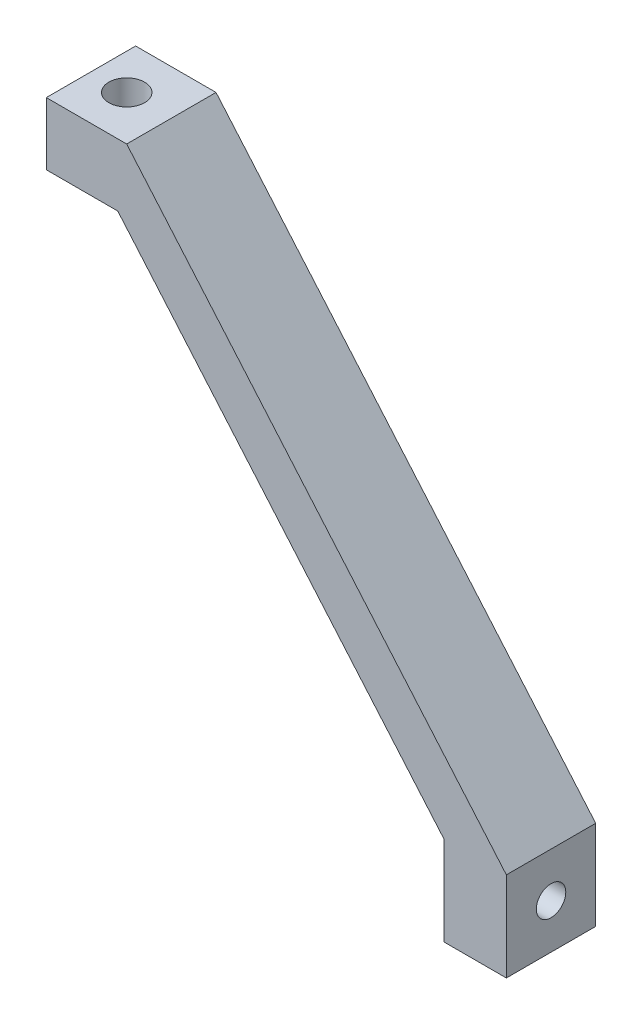
ISO-10303-21;
HEADER;
FILE_DESCRIPTION(('STEP AP214'),'2;1');
FILE_NAME('part.step','',(''),(''),'','','');
FILE_SCHEMA(('AUTOMOTIVE_DESIGN { 1 0 10303 214 1 1 1 1 }'));
ENDSEC;
DATA;
#1=APPLICATION_CONTEXT('core data for automotive mechanical design processes');
#2=APPLICATION_PROTOCOL_DEFINITION('international standard','automotive_design',2000,#1);
#3=PRODUCT_CONTEXT('',#1,'mechanical');
#4=PRODUCT('Part','Part','',(#3));
#5=PRODUCT_RELATED_PRODUCT_CATEGORY('part','',(#4));
#6=PRODUCT_DEFINITION_FORMATION('','',#4);
#7=PRODUCT_DEFINITION_CONTEXT('part definition',#1,'design');
#8=PRODUCT_DEFINITION('design','',#6,#7);
#9=PRODUCT_DEFINITION_SHAPE('','',#8);
#10=(LENGTH_UNIT() NAMED_UNIT(*) SI_UNIT(.MILLI.,.METRE.));
#11=(NAMED_UNIT(*) PLANE_ANGLE_UNIT() SI_UNIT($,.RADIAN.));
#12=(NAMED_UNIT(*) SI_UNIT($,.STERADIAN.) SOLID_ANGLE_UNIT());
#13=UNCERTAINTY_MEASURE_WITH_UNIT(LENGTH_MEASURE(1.E-05),#10,'distance_accuracy_value','');
#14=(GEOMETRIC_REPRESENTATION_CONTEXT(3) GLOBAL_UNCERTAINTY_ASSIGNED_CONTEXT((#13)) GLOBAL_UNIT_ASSIGNED_CONTEXT((#10,
#11,#12)) REPRESENTATION_CONTEXT('',''));
#15=CARTESIAN_POINT('',(0.,0.,0.));
#16=DIRECTION('',(0.,0.,1.));
#17=DIRECTION('',(1.,0.,0.));
#18=AXIS2_PLACEMENT_3D('',#15,#16,#17);
#19=CARTESIAN_POINT('',(0.,0.,10.));
#20=DIRECTION('',(-0.759384877297726,-0.650641689512375,0.));
#21=DIRECTION('',(0.650641689512375,-0.759384877297726,0.));
#22=AXIS2_PLACEMENT_3D('',#19,#20,#21);
#23=PLANE('',#22);
#24=DIRECTION('',(-0.650641689512375,0.759384877297726,0.));
#25=VECTOR('',#24,1.);
#26=CARTESIAN_POINT('',(0.,0.,0.));
#27=LINE('',#26,#25);
#28=CARTESIAN_POINT('',(0.,0.,0.));
#29=VERTEX_POINT('',#28);
#30=CARTESIAN_POINT('',(-36.4997207632834,42.6,0.));
#31=VERTEX_POINT('',#30);
#32=EDGE_CURVE('E141',#29,#31,#27,.T.);
#33=ORIENTED_EDGE('',*,*,#32,.F.);
#34=DIRECTION('',(0.,0.,-1.));
#35=VECTOR('',#34,1.);
#36=CARTESIAN_POINT('',(0.,0.,10.));
#37=LINE('',#36,#35);
#38=CARTESIAN_POINT('',(0.,0.,10.));
#39=VERTEX_POINT('',#38);
#40=EDGE_CURVE('E11',#39,#29,#37,.T.);
#41=ORIENTED_EDGE('',*,*,#40,.F.);
#42=DIRECTION('',(-0.650641689512375,0.759384877297726,0.));
#43=VECTOR('',#42,1.);
#44=CARTESIAN_POINT('',(0.,0.,10.));
#45=LINE('',#44,#43);
#46=CARTESIAN_POINT('',(-36.4997207632834,42.6,10.));
#47=VERTEX_POINT('',#46);
#48=EDGE_CURVE('E167',#39,#47,#45,.T.);
#49=ORIENTED_EDGE('',*,*,#48,.T.);
#50=DIRECTION('',(0.,0.,-1.));
#51=VECTOR('',#50,1.);
#52=CARTESIAN_POINT('',(-36.4997207632834,42.6,10.));
#53=LINE('',#52,#51);
#54=EDGE_CURVE('E58',#47,#31,#53,.T.);
#55=ORIENTED_EDGE('',*,*,#54,.T.);
#56=EDGE_LOOP('',(#33,#41,#49,#55));
#57=FACE_BOUND('',#56,.T.);
#58=ADVANCED_FACE('F40',(#57),#23,.T.);
#59=CARTESIAN_POINT('',(0.,0.,10.));
#60=DIRECTION('',(1.,0.,0.));
#61=DIRECTION('',(0.,0.,-1.));
#62=AXIS2_PLACEMENT_3D('',#59,#60,#61);
#63=PLANE('',#62);
#64=CARTESIAN_POINT('',(0.,-5.,5.));
#65=DIRECTION('',(1.,0.,0.));
#66=DIRECTION('',(0.,0.,-1.));
#67=AXIS2_PLACEMENT_3D('',#64,#65,#66);
#68=CIRCLE('',#67,1.65);
#69=CARTESIAN_POINT('',(0.,-5.,3.35));
#70=VERTEX_POINT('',#69);
#71=EDGE_CURVE('E214',#70,#70,#68,.T.);
#72=ORIENTED_EDGE('',*,*,#71,.T.);
#73=EDGE_LOOP('',(#72));
#74=FACE_BOUND('',#73,.T.);
#75=DIRECTION('',(0.,-1.,0.));
#76=VECTOR('',#75,1.);
#77=CARTESIAN_POINT('',(0.,0.,0.));
#78=LINE('',#77,#76);
#79=CARTESIAN_POINT('',(0.,-10.,0.));
#80=VERTEX_POINT('',#79);
#81=EDGE_CURVE('E144',#29,#80,#78,.T.);
#82=ORIENTED_EDGE('',*,*,#81,.T.);
#83=DIRECTION('',(0.,0.,-1.));
#84=VECTOR('',#83,1.);
#85=CARTESIAN_POINT('',(0.,-10.,10.));
#86=LINE('',#85,#84);
#87=CARTESIAN_POINT('',(0.,-10.,10.));
#88=VERTEX_POINT('',#87);
#89=EDGE_CURVE('E50',#88,#80,#86,.T.);
#90=ORIENTED_EDGE('',*,*,#89,.F.);
#91=DIRECTION('',(0.,-1.,0.));
#92=VECTOR('',#91,1.);
#93=CARTESIAN_POINT('',(0.,0.,10.));
#94=LINE('',#93,#92);
#95=EDGE_CURVE('E203',#39,#88,#94,.T.);
#96=ORIENTED_EDGE('',*,*,#95,.F.);
#97=ORIENTED_EDGE('',*,*,#40,.T.);
#98=EDGE_LOOP('',(#82,#90,#96,#97));
#99=FACE_BOUND('',#98,.T.);
#100=ADVANCED_FACE('F235',(#74,#99),#63,.F.);
#101=CARTESIAN_POINT('',(0.,-10.,10.));
#102=DIRECTION('',(0.,1.,0.));
#103=DIRECTION('',(0.,0.,1.));
#104=AXIS2_PLACEMENT_3D('',#101,#102,#103);
#105=PLANE('',#104);
#106=DIRECTION('',(1.,0.,0.));
#107=VECTOR('',#106,1.);
#108=CARTESIAN_POINT('',(0.,-10.,0.));
#109=LINE('',#108,#107);
#110=CARTESIAN_POINT('',(7.,-10.,0.));
#111=VERTEX_POINT('',#110);
#112=EDGE_CURVE('E147',#80,#111,#109,.T.);
#113=ORIENTED_EDGE('',*,*,#112,.T.);
#114=DIRECTION('',(0.,0.,-1.));
#115=VECTOR('',#114,1.);
#116=CARTESIAN_POINT('',(7.,-10.,10.));
#117=LINE('',#116,#115);
#118=CARTESIAN_POINT('',(7.,-10.,10.));
#119=VERTEX_POINT('',#118);
#120=EDGE_CURVE('E177',#119,#111,#117,.T.);
#121=ORIENTED_EDGE('',*,*,#120,.F.);
#122=DIRECTION('',(1.,0.,0.));
#123=VECTOR('',#122,1.);
#124=CARTESIAN_POINT('',(0.,-10.,10.));
#125=LINE('',#124,#123);
#126=EDGE_CURVE('E188',#88,#119,#125,.T.);
#127=ORIENTED_EDGE('',*,*,#126,.F.);
#128=ORIENTED_EDGE('',*,*,#89,.T.);
#129=EDGE_LOOP('',(#113,#121,#127,#128));
#130=FACE_BOUND('',#129,.T.);
#131=ADVANCED_FACE('F186',(#130),#105,.F.);
#132=CARTESIAN_POINT('',(7.,0.,10.));
#133=DIRECTION('',(1.,0.,0.));
#134=DIRECTION('',(0.,0.,-1.));
#135=AXIS2_PLACEMENT_3D('',#132,#133,#134);
#136=PLANE('',#135);
#137=CARTESIAN_POINT('',(7.,-5.,5.));
#138=DIRECTION('',(1.,0.,0.));
#139=DIRECTION('',(0.,0.,-1.));
#140=AXIS2_PLACEMENT_3D('',#137,#138,#139);
#141=CIRCLE('',#140,1.65);
#142=CARTESIAN_POINT('',(7.,-5.,3.35));
#143=VERTEX_POINT('',#142);
#144=EDGE_CURVE('E218',#143,#143,#141,.T.);
#145=ORIENTED_EDGE('',*,*,#144,.F.);
#146=EDGE_LOOP('',(#145));
#147=FACE_BOUND('',#146,.T.);
#148=DIRECTION('',(0.,-1.,0.));
#149=VECTOR('',#148,1.);
#150=CARTESIAN_POINT('',(7.,0.,0.));
#151=LINE('',#150,#149);
#152=CARTESIAN_POINT('',(7.,0.,0.));
#153=VERTEX_POINT('',#152);
#154=EDGE_CURVE('E151',#153,#111,#151,.T.);
#155=ORIENTED_EDGE('',*,*,#154,.F.);
#156=DIRECTION('',(0.,0.,-1.));
#157=VECTOR('',#156,1.);
#158=CARTESIAN_POINT('',(7.,0.,10.));
#159=LINE('',#158,#157);
#160=CARTESIAN_POINT('',(7.,0.,10.));
#161=VERTEX_POINT('',#160);
#162=EDGE_CURVE('E174',#161,#153,#159,.T.);
#163=ORIENTED_EDGE('',*,*,#162,.F.);
#164=DIRECTION('',(0.,-1.,0.));
#165=VECTOR('',#164,1.);
#166=CARTESIAN_POINT('',(7.,0.,10.));
#167=LINE('',#166,#165);
#168=EDGE_CURVE('E198',#161,#119,#167,.T.);
#169=ORIENTED_EDGE('',*,*,#168,.T.);
#170=ORIENTED_EDGE('',*,*,#120,.T.);
#171=EDGE_LOOP('',(#155,#163,#169,#170));
#172=FACE_BOUND('',#171,.T.);
#173=ADVANCED_FACE('F196',(#147,#172),#136,.T.);
#174=CARTESIAN_POINT('',(4.03644281726323,3.45864555914692,10.));
#175=DIRECTION('',(-0.759364660871482,-0.650665284012862,0.));
#176=DIRECTION('',(0.650665284012862,-0.759364660871482,0.));
#177=AXIS2_PLACEMENT_3D('',#174,#175,#176);
#178=PLANE('',#177);
#179=DIRECTION('',(-0.650665284012862,0.759364660871482,0.));
#180=VECTOR('',#179,1.);
#181=CARTESIAN_POINT('',(4.03644281726323,3.45864555914692,0.));
#182=LINE('',#181,#180);
#183=CARTESIAN_POINT('',(-35.5,49.6,0.));
#184=VERTEX_POINT('',#183);
#185=EDGE_CURVE('E155',#153,#184,#182,.T.);
#186=ORIENTED_EDGE('',*,*,#185,.T.);
#187=DIRECTION('',(0.,0.,-1.));
#188=VECTOR('',#187,1.);
#189=CARTESIAN_POINT('',(-35.5,49.6,10.));
#190=LINE('',#189,#188);
#191=CARTESIAN_POINT('',(-35.5,49.6,10.));
#192=VERTEX_POINT('',#191);
#193=EDGE_CURVE('E131',#192,#184,#190,.T.);
#194=ORIENTED_EDGE('',*,*,#193,.F.);
#195=DIRECTION('',(-0.650665284012862,0.759364660871482,0.));
#196=VECTOR('',#195,1.);
#197=CARTESIAN_POINT('',(4.03644281726323,3.45864555914692,10.));
#198=LINE('',#197,#196);
#199=EDGE_CURVE('E117',#161,#192,#198,.T.);
#200=ORIENTED_EDGE('',*,*,#199,.F.);
#201=ORIENTED_EDGE('',*,*,#162,.T.);
#202=EDGE_LOOP('',(#186,#194,#200,#201));
#203=FACE_BOUND('',#202,.T.);
#204=ADVANCED_FACE('F227',(#203),#178,.F.);
#205=CARTESIAN_POINT('',(0.,49.6,10.));
#206=DIRECTION('',(0.,-1.,0.));
#207=DIRECTION('',(0.,0.,-1.));
#208=AXIS2_PLACEMENT_3D('',#205,#206,#207);
#209=PLANE('',#208);
#210=CARTESIAN_POINT('',(-40.5,49.6,5.));
#211=DIRECTION('',(0.,1.,0.));
#212=DIRECTION('',(0.,0.,1.));
#213=AXIS2_PLACEMENT_3D('',#210,#211,#212);
#214=CIRCLE('',#213,2.);
#215=CARTESIAN_POINT('',(-40.5,49.6,7.));
#216=VERTEX_POINT('',#215);
#217=EDGE_CURVE('E210',#216,#216,#214,.T.);
#218=ORIENTED_EDGE('',*,*,#217,.F.);
#219=EDGE_LOOP('',(#218));
#220=FACE_BOUND('',#219,.T.);
#221=DIRECTION('',(-1.,0.,0.));
#222=VECTOR('',#221,1.);
#223=CARTESIAN_POINT('',(0.,49.6,0.));
#224=LINE('',#223,#222);
#225=CARTESIAN_POINT('',(-44.5,49.6,0.));
#226=VERTEX_POINT('',#225);
#227=EDGE_CURVE('E127',#184,#226,#224,.T.);
#228=ORIENTED_EDGE('',*,*,#227,.T.);
#229=DIRECTION('',(0.,0.,-1.));
#230=VECTOR('',#229,1.);
#231=CARTESIAN_POINT('',(-44.5,49.6,10.));
#232=LINE('',#231,#230);
#233=CARTESIAN_POINT('',(-44.5,49.6,10.));
#234=VERTEX_POINT('',#233);
#235=EDGE_CURVE('E124',#234,#226,#232,.T.);
#236=ORIENTED_EDGE('',*,*,#235,.F.);
#237=DIRECTION('',(-1.,0.,0.));
#238=VECTOR('',#237,1.);
#239=CARTESIAN_POINT('',(0.,49.6,10.));
#240=LINE('',#239,#238);
#241=EDGE_CURVE('E108',#192,#234,#240,.T.);
#242=ORIENTED_EDGE('',*,*,#241,.F.);
#243=ORIENTED_EDGE('',*,*,#193,.T.);
#244=EDGE_LOOP('',(#228,#236,#242,#243));
#245=FACE_BOUND('',#244,.T.);
#246=ADVANCED_FACE('F125',(#220,#245),#209,.F.);
#247=CARTESIAN_POINT('',(-44.5,0.,10.));
#248=DIRECTION('',(1.,0.,0.));
#249=DIRECTION('',(0.,0.,-1.));
#250=AXIS2_PLACEMENT_3D('',#247,#248,#249);
#251=PLANE('',#250);
#252=DIRECTION('',(0.,-1.,0.));
#253=VECTOR('',#252,1.);
#254=CARTESIAN_POINT('',(-44.5,0.,0.));
#255=LINE('',#254,#253);
#256=CARTESIAN_POINT('',(-44.5,42.6,0.));
#257=VERTEX_POINT('',#256);
#258=EDGE_CURVE('E160',#226,#257,#255,.T.);
#259=ORIENTED_EDGE('',*,*,#258,.T.);
#260=DIRECTION('',(0.,0.,-1.));
#261=VECTOR('',#260,1.);
#262=CARTESIAN_POINT('',(-44.5,42.6,10.));
#263=LINE('',#262,#261);
#264=CARTESIAN_POINT('',(-44.5,42.6,10.));
#265=VERTEX_POINT('',#264);
#266=EDGE_CURVE('E84',#265,#257,#263,.T.);
#267=ORIENTED_EDGE('',*,*,#266,.F.);
#268=DIRECTION('',(0.,-1.,0.));
#269=VECTOR('',#268,1.);
#270=CARTESIAN_POINT('',(-44.5,0.,10.));
#271=LINE('',#270,#269);
#272=EDGE_CURVE('E114',#234,#265,#271,.T.);
#273=ORIENTED_EDGE('',*,*,#272,.F.);
#274=ORIENTED_EDGE('',*,*,#235,.T.);
#275=EDGE_LOOP('',(#259,#267,#273,#274));
#276=FACE_BOUND('',#275,.T.);
#277=ADVANCED_FACE('F133',(#276),#251,.F.);
#278=CARTESIAN_POINT('',(0.,42.6,10.));
#279=DIRECTION('',(0.,-1.,0.));
#280=DIRECTION('',(0.,0.,-1.));
#281=AXIS2_PLACEMENT_3D('',#278,#279,#280);
#282=PLANE('',#281);
#283=CARTESIAN_POINT('',(-40.5,42.6,5.));
#284=DIRECTION('',(0.,-1.,0.));
#285=DIRECTION('',(0.,0.,-1.));
#286=AXIS2_PLACEMENT_3D('',#283,#284,#285);
#287=CIRCLE('',#286,2.);
#288=CARTESIAN_POINT('',(-40.5,42.6,3.));
#289=VERTEX_POINT('',#288);
#290=EDGE_CURVE('E43',#289,#289,#287,.T.);
#291=ORIENTED_EDGE('',*,*,#290,.F.);
#292=EDGE_LOOP('',(#291));
#293=FACE_BOUND('',#292,.T.);
#294=DIRECTION('',(-1.,0.,0.));
#295=VECTOR('',#294,1.);
#296=CARTESIAN_POINT('',(0.,42.6,0.));
#297=LINE('',#296,#295);
#298=EDGE_CURVE('E163',#31,#257,#297,.T.);
#299=ORIENTED_EDGE('',*,*,#298,.F.);
#300=ORIENTED_EDGE('',*,*,#54,.F.);
#301=DIRECTION('',(-1.,0.,0.));
#302=VECTOR('',#301,1.);
#303=CARTESIAN_POINT('',(0.,42.6,10.));
#304=LINE('',#303,#302);
#305=EDGE_CURVE('E135',#47,#265,#304,.T.);
#306=ORIENTED_EDGE('',*,*,#305,.T.);
#307=ORIENTED_EDGE('',*,*,#266,.T.);
#308=EDGE_LOOP('',(#299,#300,#306,#307));
#309=FACE_BOUND('',#308,.T.);
#310=ADVANCED_FACE('F242',(#293,#309),#282,.T.);
#311=CARTESIAN_POINT('',(0.,0.,10.));
#312=DIRECTION('',(0.,0.,1.));
#313=DIRECTION('',(1.,0.,0.));
#314=AXIS2_PLACEMENT_3D('',#311,#312,#313);
#315=PLANE('',#314);
#316=ORIENTED_EDGE('',*,*,#48,.F.);
#317=ORIENTED_EDGE('',*,*,#95,.T.);
#318=ORIENTED_EDGE('',*,*,#126,.T.);
#319=ORIENTED_EDGE('',*,*,#168,.F.);
#320=ORIENTED_EDGE('',*,*,#199,.T.);
#321=ORIENTED_EDGE('',*,*,#241,.T.);
#322=ORIENTED_EDGE('',*,*,#272,.T.);
#323=ORIENTED_EDGE('',*,*,#305,.F.);
#324=EDGE_LOOP('',(#316,#317,#318,#319,#320,#321,#322,#323));
#325=FACE_BOUND('',#324,.T.);
#326=ADVANCED_FACE('F111',(#325),#315,.T.);
#327=CARTESIAN_POINT('',(0.,0.,0.));
#328=DIRECTION('',(0.,0.,1.));
#329=DIRECTION('',(1.,0.,0.));
#330=AXIS2_PLACEMENT_3D('',#327,#328,#329);
#331=PLANE('',#330);
#332=ORIENTED_EDGE('',*,*,#32,.T.);
#333=ORIENTED_EDGE('',*,*,#298,.T.);
#334=ORIENTED_EDGE('',*,*,#258,.F.);
#335=ORIENTED_EDGE('',*,*,#227,.F.);
#336=ORIENTED_EDGE('',*,*,#185,.F.);
#337=ORIENTED_EDGE('',*,*,#154,.T.);
#338=ORIENTED_EDGE('',*,*,#112,.F.);
#339=ORIENTED_EDGE('',*,*,#81,.F.);
#340=EDGE_LOOP('',(#332,#333,#334,#335,#336,#337,#338,#339));
#341=FACE_BOUND('',#340,.T.);
#342=ADVANCED_FACE('F192',(#341),#331,.F.);
#343=CARTESIAN_POINT('',(-40.5,39.6,5.));
#344=DIRECTION('',(0.,1.,0.));
#345=DIRECTION('',(0.,0.,1.));
#346=AXIS2_PLACEMENT_3D('',#343,#344,#345);
#347=CYLINDRICAL_SURFACE('',#346,2.);
#348=ORIENTED_EDGE('',*,*,#290,.T.);
#349=EDGE_LOOP('',(#348));
#350=FACE_BOUND('',#349,.T.);
#351=ORIENTED_EDGE('',*,*,#217,.T.);
#352=EDGE_LOOP('',(#351));
#353=FACE_BOUND('',#352,.T.);
#354=ADVANCED_FACE('F261',(#350,#353),#347,.F.);
#355=CARTESIAN_POINT('',(-3.,-5.,5.));
#356=DIRECTION('',(1.,0.,0.));
#357=DIRECTION('',(0.,0.,-1.));
#358=AXIS2_PLACEMENT_3D('',#355,#356,#357);
#359=CYLINDRICAL_SURFACE('',#358,1.65);
#360=ORIENTED_EDGE('',*,*,#144,.T.);
#361=EDGE_LOOP('',(#360));
#362=FACE_BOUND('',#361,.T.);
#363=ORIENTED_EDGE('',*,*,#71,.F.);
#364=EDGE_LOOP('',(#363));
#365=FACE_BOUND('',#364,.T.);
#366=ADVANCED_FACE('F223',(#362,#365),#359,.F.);
#367=CLOSED_SHELL('',(#58,#100,#131,#173,#204,#246,#277,#310,#326,#342,#354,#366));
#368=MANIFOLD_SOLID_BREP('B2',#367);
#369=ADVANCED_BREP_SHAPE_REPRESENTATION('',(#18,#368),#14);
#370=SHAPE_DEFINITION_REPRESENTATION(#9,#369);
ENDSEC;
END-ISO-10303-21;
